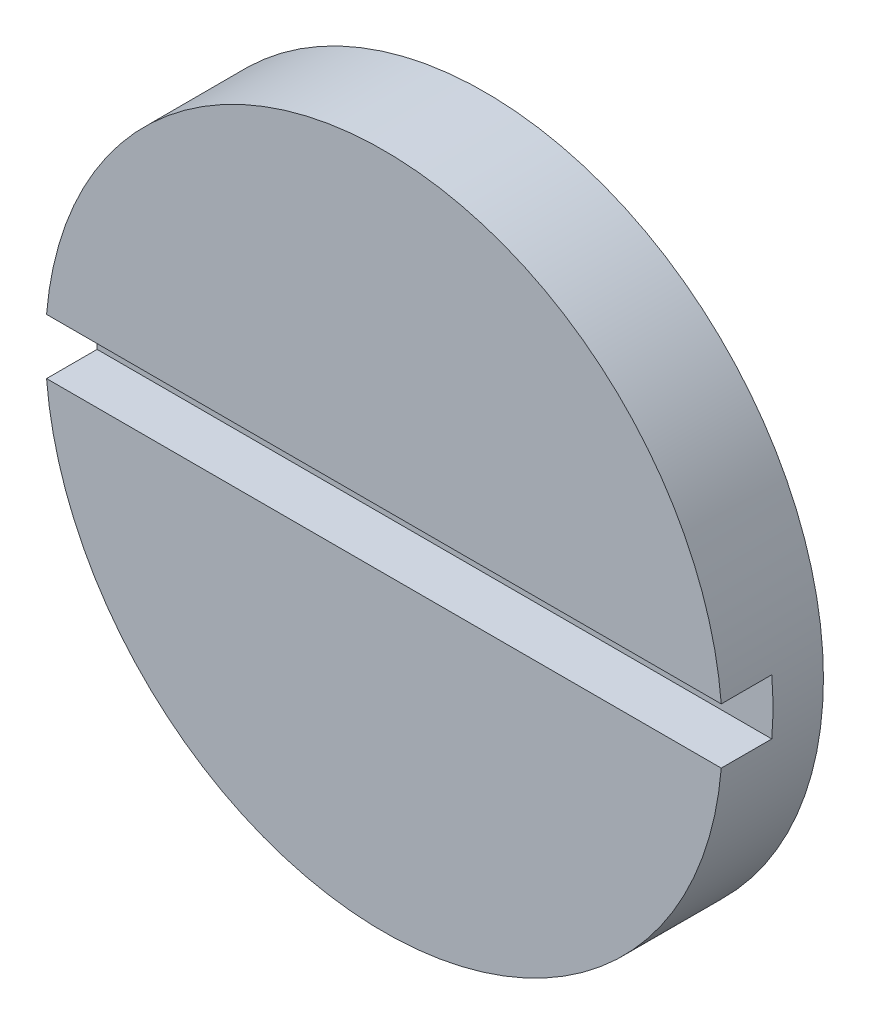
ISO-10303-21;
HEADER;
FILE_DESCRIPTION(('STEP AP214'),'2;1');
FILE_NAME('part.step','',(''),(''),'','','');
FILE_SCHEMA(('AUTOMOTIVE_DESIGN { 1 0 10303 214 1 1 1 1 }'));
ENDSEC;
DATA;
#1=APPLICATION_CONTEXT('core data for automotive mechanical design processes');
#2=APPLICATION_PROTOCOL_DEFINITION('international standard','automotive_design',2000,#1);
#3=PRODUCT_CONTEXT('',#1,'mechanical');
#4=PRODUCT('Part','Part','',(#3));
#5=PRODUCT_RELATED_PRODUCT_CATEGORY('part','',(#4));
#6=PRODUCT_DEFINITION_FORMATION('','',#4);
#7=PRODUCT_DEFINITION_CONTEXT('part definition',#1,'design');
#8=PRODUCT_DEFINITION('design','',#6,#7);
#9=PRODUCT_DEFINITION_SHAPE('','',#8);
#10=(LENGTH_UNIT() NAMED_UNIT(*) SI_UNIT(.MILLI.,.METRE.));
#11=(NAMED_UNIT(*) PLANE_ANGLE_UNIT() SI_UNIT($,.RADIAN.));
#12=(NAMED_UNIT(*) SI_UNIT($,.STERADIAN.) SOLID_ANGLE_UNIT());
#13=UNCERTAINTY_MEASURE_WITH_UNIT(LENGTH_MEASURE(1.E-05),#10,'distance_accuracy_value','');
#14=(GEOMETRIC_REPRESENTATION_CONTEXT(3) GLOBAL_UNCERTAINTY_ASSIGNED_CONTEXT((#13)) GLOBAL_UNIT_ASSIGNED_CONTEXT((#10,
#11,#12)) REPRESENTATION_CONTEXT('',''));
#15=CARTESIAN_POINT('',(0.,0.,0.));
#16=DIRECTION('',(0.,0.,1.));
#17=DIRECTION('',(1.,0.,0.));
#18=AXIS2_PLACEMENT_3D('',#15,#16,#17);
#19=CARTESIAN_POINT('',(0.,0.,4.));
#20=DIRECTION('',(0.,0.,-1.));
#21=DIRECTION('',(0.,-1.,0.));
#22=AXIS2_PLACEMENT_3D('',#19,#20,#21);
#23=CYLINDRICAL_SURFACE('',#22,13.4);
#24=CARTESIAN_POINT('',(0.,0.,2.));
#25=DIRECTION('',(0.,0.,1.));
#26=DIRECTION('',(1.,0.,0.));
#27=AXIS2_PLACEMENT_3D('',#24,#25,#26);
#28=CIRCLE('',#27,13.4);
#29=CARTESIAN_POINT('',(-13.3547744271478,1.1,2.));
#30=VERTEX_POINT('',#29);
#31=CARTESIAN_POINT('',(-13.3547744271478,-1.1,2.));
#32=VERTEX_POINT('',#31);
#33=EDGE_CURVE('E33',#30,#32,#28,.T.);
#34=ORIENTED_EDGE('',*,*,#33,.F.);
#35=DIRECTION('',(0.,0.,1.));
#36=VECTOR('',#35,1.);
#37=CARTESIAN_POINT('',(-13.3547744271478,1.1,4.));
#38=LINE('',#37,#36);
#39=CARTESIAN_POINT('',(-13.3547744271478,1.1,4.));
#40=VERTEX_POINT('',#39);
#41=EDGE_CURVE('E11',#30,#40,#38,.T.);
#42=ORIENTED_EDGE('',*,*,#41,.T.);
#43=CARTESIAN_POINT('',(0.,0.,4.));
#44=DIRECTION('',(0.,0.,1.));
#45=DIRECTION('',(1.,0.,0.));
#46=AXIS2_PLACEMENT_3D('',#43,#44,#45);
#47=CIRCLE('',#46,13.4);
#48=CARTESIAN_POINT('',(13.3547744271478,1.1,4.));
#49=VERTEX_POINT('',#48);
#50=EDGE_CURVE('E62',#49,#40,#47,.T.);
#51=ORIENTED_EDGE('',*,*,#50,.F.);
#52=DIRECTION('',(0.,0.,-1.));
#53=VECTOR('',#52,1.);
#54=CARTESIAN_POINT('',(13.3547744271478,1.1,4.));
#55=LINE('',#54,#53);
#56=CARTESIAN_POINT('',(13.3547744271478,1.1,2.));
#57=VERTEX_POINT('',#56);
#58=EDGE_CURVE('E25',#49,#57,#55,.T.);
#59=ORIENTED_EDGE('',*,*,#58,.T.);
#60=CARTESIAN_POINT('',(0.,0.,2.));
#61=DIRECTION('',(0.,0.,1.));
#62=DIRECTION('',(1.,0.,0.));
#63=AXIS2_PLACEMENT_3D('',#60,#61,#62);
#64=CIRCLE('',#63,13.4);
#65=CARTESIAN_POINT('',(13.3547744271478,-1.1,2.));
#66=VERTEX_POINT('',#65);
#67=EDGE_CURVE('E77',#66,#57,#64,.T.);
#68=ORIENTED_EDGE('',*,*,#67,.F.);
#69=DIRECTION('',(0.,0.,1.));
#70=VECTOR('',#69,1.);
#71=CARTESIAN_POINT('',(13.3547744271478,-1.1,4.));
#72=LINE('',#71,#70);
#73=CARTESIAN_POINT('',(13.3547744271478,-1.1,4.));
#74=VERTEX_POINT('',#73);
#75=EDGE_CURVE('E60',#66,#74,#72,.T.);
#76=ORIENTED_EDGE('',*,*,#75,.T.);
#77=CARTESIAN_POINT('',(0.,0.,4.));
#78=DIRECTION('',(0.,0.,1.));
#79=DIRECTION('',(1.,0.,0.));
#80=AXIS2_PLACEMENT_3D('',#77,#78,#79);
#81=CIRCLE('',#80,13.4);
#82=CARTESIAN_POINT('',(-13.3547744271478,-1.1,4.));
#83=VERTEX_POINT('',#82);
#84=EDGE_CURVE('E53',#83,#74,#81,.T.);
#85=ORIENTED_EDGE('',*,*,#84,.F.);
#86=DIRECTION('',(0.,0.,-1.));
#87=VECTOR('',#86,1.);
#88=CARTESIAN_POINT('',(-13.3547744271478,-1.1,4.));
#89=LINE('',#88,#87);
#90=EDGE_CURVE('E57',#83,#32,#89,.T.);
#91=ORIENTED_EDGE('',*,*,#90,.T.);
#92=EDGE_LOOP('',(#34,#42,#51,#59,#68,#76,#85,#91));
#93=FACE_BOUND('',#92,.T.);
#94=CARTESIAN_POINT('',(0.,0.,0.));
#95=DIRECTION('',(0.,0.,1.));
#96=DIRECTION('',(1.,0.,0.));
#97=AXIS2_PLACEMENT_3D('',#94,#95,#96);
#98=CIRCLE('',#97,13.4);
#99=CARTESIAN_POINT('',(13.4,0.,0.));
#100=VERTEX_POINT('',#99);
#101=EDGE_CURVE('E69',#100,#100,#98,.T.);
#102=ORIENTED_EDGE('',*,*,#101,.T.);
#103=EDGE_LOOP('',(#102));
#104=FACE_BOUND('',#103,.T.);
#105=ADVANCED_FACE('F16',(#93,#104),#23,.T.);
#106=CARTESIAN_POINT('',(0.,0.,4.));
#107=DIRECTION('',(0.,0.,1.));
#108=DIRECTION('',(1.,0.,0.));
#109=AXIS2_PLACEMENT_3D('',#106,#107,#108);
#110=PLANE('',#109);
#111=DIRECTION('',(-1.,0.,0.));
#112=VECTOR('',#111,1.);
#113=CARTESIAN_POINT('',(0.,1.1,4.));
#114=LINE('',#113,#112);
#115=EDGE_CURVE('E72',#49,#40,#114,.T.);
#116=ORIENTED_EDGE('',*,*,#115,.F.);
#117=ORIENTED_EDGE('',*,*,#50,.T.);
#118=EDGE_LOOP('',(#116,#117));
#119=FACE_BOUND('',#118,.T.);
#120=ADVANCED_FACE('F90',(#119),#110,.T.);
#121=CARTESIAN_POINT('',(0.,0.,4.));
#122=DIRECTION('',(0.,0.,1.));
#123=DIRECTION('',(1.,0.,0.));
#124=AXIS2_PLACEMENT_3D('',#121,#122,#123);
#125=PLANE('',#124);
#126=DIRECTION('',(1.,0.,0.));
#127=VECTOR('',#126,1.);
#128=CARTESIAN_POINT('',(0.,-1.1,4.));
#129=LINE('',#128,#127);
#130=EDGE_CURVE('E66',#83,#74,#129,.T.);
#131=ORIENTED_EDGE('',*,*,#130,.F.);
#132=ORIENTED_EDGE('',*,*,#84,.T.);
#133=EDGE_LOOP('',(#131,#132));
#134=FACE_BOUND('',#133,.T.);
#135=ADVANCED_FACE('F71',(#134),#125,.T.);
#136=CARTESIAN_POINT('',(0.,0.,0.));
#137=DIRECTION('',(0.,0.,1.));
#138=DIRECTION('',(1.,0.,0.));
#139=AXIS2_PLACEMENT_3D('',#136,#137,#138);
#140=PLANE('',#139);
#141=ORIENTED_EDGE('',*,*,#101,.F.);
#142=EDGE_LOOP('',(#141));
#143=FACE_BOUND('',#142,.T.);
#144=ADVANCED_FACE('F97',(#143),#140,.F.);
#145=CARTESIAN_POINT('',(0.,0.,2.));
#146=DIRECTION('',(0.,0.,1.));
#147=DIRECTION('',(1.,0.,0.));
#148=AXIS2_PLACEMENT_3D('',#145,#146,#147);
#149=PLANE('',#148);
#150=ORIENTED_EDGE('',*,*,#33,.T.);
#151=DIRECTION('',(1.,0.,0.));
#152=VECTOR('',#151,1.);
#153=CARTESIAN_POINT('',(15.,-1.1,2.));
#154=LINE('',#153,#152);
#155=EDGE_CURVE('E68',#32,#66,#154,.T.);
#156=ORIENTED_EDGE('',*,*,#155,.T.);
#157=ORIENTED_EDGE('',*,*,#67,.T.);
#158=DIRECTION('',(-1.,0.,0.));
#159=VECTOR('',#158,1.);
#160=CARTESIAN_POINT('',(15.,1.1,2.));
#161=LINE('',#160,#159);
#162=EDGE_CURVE('E19',#57,#30,#161,.T.);
#163=ORIENTED_EDGE('',*,*,#162,.T.);
#164=EDGE_LOOP('',(#150,#156,#157,#163));
#165=FACE_BOUND('',#164,.T.);
#166=ADVANCED_FACE('F95',(#165),#149,.T.);
#167=CARTESIAN_POINT('',(15.,1.1,2.));
#168=DIRECTION('',(0.,1.,0.));
#169=DIRECTION('',(-1.,0.,0.));
#170=AXIS2_PLACEMENT_3D('',#167,#168,#169);
#171=PLANE('',#170);
#172=ORIENTED_EDGE('',*,*,#115,.T.);
#173=ORIENTED_EDGE('',*,*,#41,.F.);
#174=ORIENTED_EDGE('',*,*,#162,.F.);
#175=ORIENTED_EDGE('',*,*,#58,.F.);
#176=EDGE_LOOP('',(#172,#173,#174,#175));
#177=FACE_BOUND('',#176,.T.);
#178=ADVANCED_FACE('F94',(#177),#171,.F.);
#179=CARTESIAN_POINT('',(15.,-1.1,2.));
#180=DIRECTION('',(0.,-1.,0.));
#181=DIRECTION('',(1.,0.,0.));
#182=AXIS2_PLACEMENT_3D('',#179,#180,#181);
#183=PLANE('',#182);
#184=ORIENTED_EDGE('',*,*,#130,.T.);
#185=ORIENTED_EDGE('',*,*,#75,.F.);
#186=ORIENTED_EDGE('',*,*,#155,.F.);
#187=ORIENTED_EDGE('',*,*,#90,.F.);
#188=EDGE_LOOP('',(#184,#185,#186,#187));
#189=FACE_BOUND('',#188,.T.);
#190=ADVANCED_FACE('F65',(#189),#183,.F.);
#191=CLOSED_SHELL('',(#105,#120,#135,#144,#166,#178,#190));
#192=MANIFOLD_SOLID_BREP('B1',#191);
#193=ADVANCED_BREP_SHAPE_REPRESENTATION('',(#18,#192),#14);
#194=SHAPE_DEFINITION_REPRESENTATION(#9,#193);
ENDSEC;
END-ISO-10303-21;
